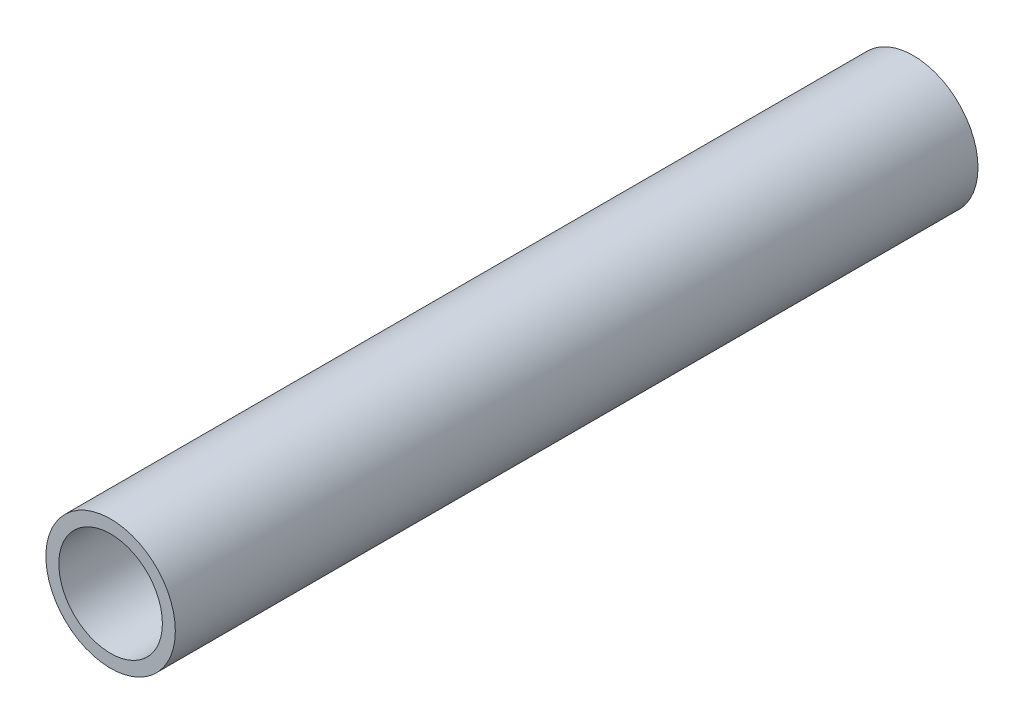
ISO-10303-21;
HEADER;
FILE_DESCRIPTION(('STEP AP214'),'2;1');
FILE_NAME('part.step','',(''),(''),'','','');
FILE_SCHEMA(('AUTOMOTIVE_DESIGN { 1 0 10303 214 1 1 1 1 }'));
ENDSEC;
DATA;
#1=APPLICATION_CONTEXT('core data for automotive mechanical design processes');
#2=APPLICATION_PROTOCOL_DEFINITION('international standard','automotive_design',2000,#1);
#3=PRODUCT_CONTEXT('',#1,'mechanical');
#4=PRODUCT('Part','Part','',(#3));
#5=PRODUCT_RELATED_PRODUCT_CATEGORY('part','',(#4));
#6=PRODUCT_DEFINITION_FORMATION('','',#4);
#7=PRODUCT_DEFINITION_CONTEXT('part definition',#1,'design');
#8=PRODUCT_DEFINITION('design','',#6,#7);
#9=PRODUCT_DEFINITION_SHAPE('','',#8);
#10=(LENGTH_UNIT() NAMED_UNIT(*) SI_UNIT(.MILLI.,.METRE.));
#11=(NAMED_UNIT(*) PLANE_ANGLE_UNIT() SI_UNIT($,.RADIAN.));
#12=(NAMED_UNIT(*) SI_UNIT($,.STERADIAN.) SOLID_ANGLE_UNIT());
#13=UNCERTAINTY_MEASURE_WITH_UNIT(LENGTH_MEASURE(1.E-05),#10,'distance_accuracy_value','');
#14=(GEOMETRIC_REPRESENTATION_CONTEXT(3) GLOBAL_UNCERTAINTY_ASSIGNED_CONTEXT((#13)) GLOBAL_UNIT_ASSIGNED_CONTEXT((#10,
#11,#12)) REPRESENTATION_CONTEXT('',''));
#15=CARTESIAN_POINT('',(0.,0.,0.));
#16=DIRECTION('',(0.,0.,1.));
#17=DIRECTION('',(1.,0.,0.));
#18=AXIS2_PLACEMENT_3D('',#15,#16,#17);
#19=CARTESIAN_POINT('',(0.,0.,196.85));
#20=DIRECTION('',(0.,0.,1.));
#21=DIRECTION('',(1.,0.,0.));
#22=AXIS2_PLACEMENT_3D('',#19,#20,#21);
#23=PLANE('',#22);
#24=CARTESIAN_POINT('',(0.,0.,196.85));
#25=DIRECTION('',(0.,0.,1.));
#26=DIRECTION('',(1.,0.,0.));
#27=AXIS2_PLACEMENT_3D('',#24,#25,#26);
#28=CIRCLE('',#27,15.875);
#29=CARTESIAN_POINT('',(15.875,0.,196.85));
#30=VERTEX_POINT('',#29);
#31=EDGE_CURVE('E10',#30,#30,#28,.T.);
#32=ORIENTED_EDGE('',*,*,#31,.T.);
#33=EDGE_LOOP('',(#32));
#34=FACE_BOUND('',#33,.T.);
#35=CARTESIAN_POINT('',(0.,0.,196.85));
#36=DIRECTION('',(0.,0.,1.));
#37=DIRECTION('',(1.,0.,0.));
#38=AXIS2_PLACEMENT_3D('',#35,#36,#37);
#39=CIRCLE('',#38,12.7);
#40=CARTESIAN_POINT('',(12.7,0.,196.85));
#41=VERTEX_POINT('',#40);
#42=EDGE_CURVE('E46',#41,#41,#39,.T.);
#43=ORIENTED_EDGE('',*,*,#42,.F.);
#44=EDGE_LOOP('',(#43));
#45=FACE_BOUND('',#44,.T.);
#46=ADVANCED_FACE('F35',(#34,#45),#23,.T.);
#47=CARTESIAN_POINT('',(0.,0.,0.));
#48=DIRECTION('',(0.,0.,1.));
#49=DIRECTION('',(1.,0.,0.));
#50=AXIS2_PLACEMENT_3D('',#47,#48,#49);
#51=PLANE('',#50);
#52=CARTESIAN_POINT('',(0.,0.,0.));
#53=DIRECTION('',(0.,0.,1.));
#54=DIRECTION('',(1.,0.,0.));
#55=AXIS2_PLACEMENT_3D('',#52,#53,#54);
#56=CIRCLE('',#55,15.875);
#57=CARTESIAN_POINT('',(15.875,0.,0.));
#58=VERTEX_POINT('',#57);
#59=EDGE_CURVE('E39',#58,#58,#56,.T.);
#60=ORIENTED_EDGE('',*,*,#59,.F.);
#61=EDGE_LOOP('',(#60));
#62=FACE_BOUND('',#61,.T.);
#63=CARTESIAN_POINT('',(0.,0.,0.));
#64=DIRECTION('',(0.,0.,1.));
#65=DIRECTION('',(1.,0.,0.));
#66=AXIS2_PLACEMENT_3D('',#63,#64,#65);
#67=CIRCLE('',#66,12.7);
#68=CARTESIAN_POINT('',(12.7,0.,0.));
#69=VERTEX_POINT('',#68);
#70=EDGE_CURVE('E48',#69,#69,#67,.T.);
#71=ORIENTED_EDGE('',*,*,#70,.T.);
#72=EDGE_LOOP('',(#71));
#73=FACE_BOUND('',#72,.T.);
#74=ADVANCED_FACE('F58',(#62,#73),#51,.F.);
#75=CARTESIAN_POINT('',(0.,0.,196.85));
#76=DIRECTION('',(0.,0.,-1.));
#77=DIRECTION('',(-1.,0.,0.));
#78=AXIS2_PLACEMENT_3D('',#75,#76,#77);
#79=CYLINDRICAL_SURFACE('',#78,15.875);
#80=ORIENTED_EDGE('',*,*,#31,.F.);
#81=EDGE_LOOP('',(#80));
#82=FACE_BOUND('',#81,.T.);
#83=ORIENTED_EDGE('',*,*,#59,.T.);
#84=EDGE_LOOP('',(#83));
#85=FACE_BOUND('',#84,.T.);
#86=ADVANCED_FACE('F37',(#82,#85),#79,.T.);
#87=CARTESIAN_POINT('',(0.,0.,196.85));
#88=DIRECTION('',(0.,0.,-1.));
#89=DIRECTION('',(-1.,0.,0.));
#90=AXIS2_PLACEMENT_3D('',#87,#88,#89);
#91=CYLINDRICAL_SURFACE('',#90,12.7);
#92=ORIENTED_EDGE('',*,*,#42,.T.);
#93=EDGE_LOOP('',(#92));
#94=FACE_BOUND('',#93,.T.);
#95=ORIENTED_EDGE('',*,*,#70,.F.);
#96=EDGE_LOOP('',(#95));
#97=FACE_BOUND('',#96,.T.);
#98=ADVANCED_FACE('F54',(#94,#97),#91,.F.);
#99=CLOSED_SHELL('',(#46,#74,#86,#98));
#100=MANIFOLD_SOLID_BREP('B2',#99);
#101=ADVANCED_BREP_SHAPE_REPRESENTATION('',(#18,#100),#14);
#102=SHAPE_DEFINITION_REPRESENTATION(#9,#101);
ENDSEC;
END-ISO-10303-21;
